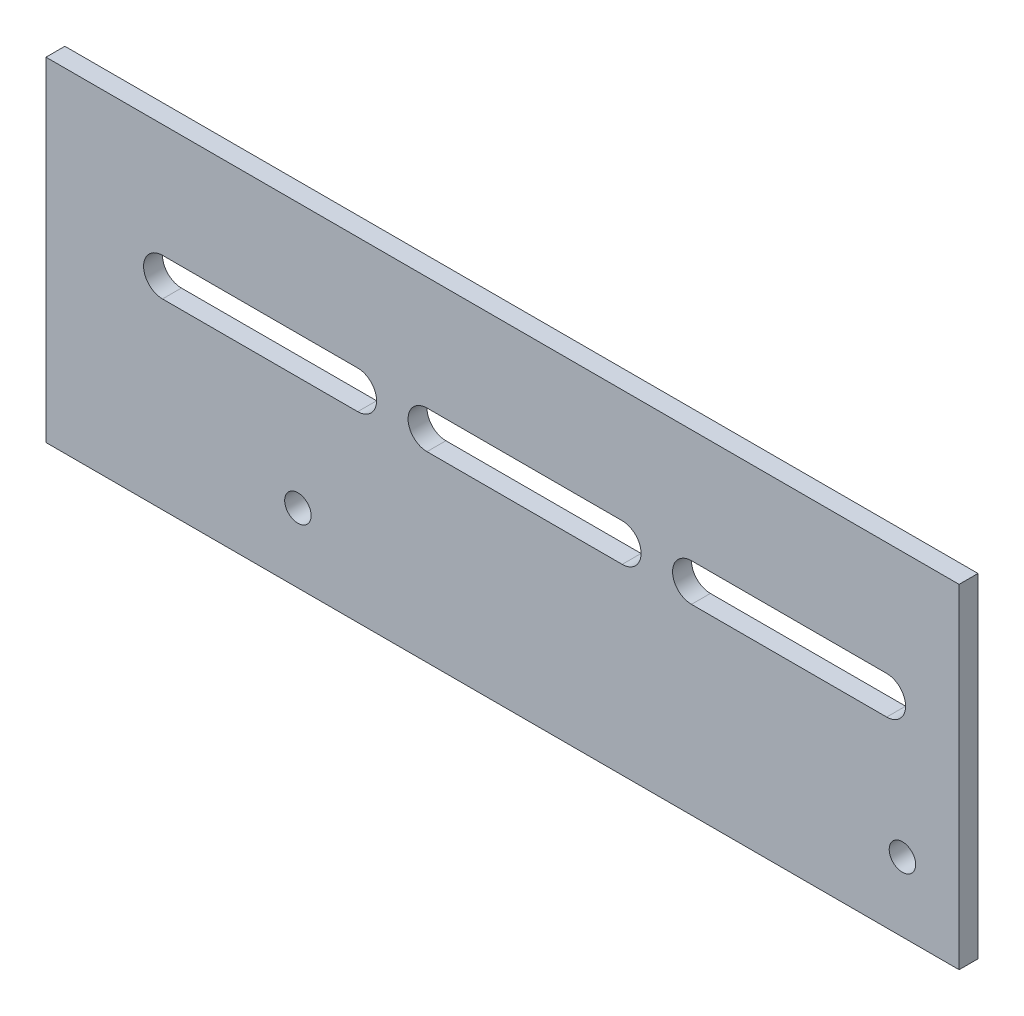
ISO-10303-21;
HEADER;
FILE_DESCRIPTION(('STEP AP214'),'2;1');
FILE_NAME('part.step','',(''),(''),'','','');
FILE_SCHEMA(('AUTOMOTIVE_DESIGN { 1 0 10303 214 1 1 1 1 }'));
ENDSEC;
DATA;
#1=APPLICATION_CONTEXT('core data for automotive mechanical design processes');
#2=APPLICATION_PROTOCOL_DEFINITION('international standard','automotive_design',2000,#1);
#3=PRODUCT_CONTEXT('',#1,'mechanical');
#4=PRODUCT('Part','Part','',(#3));
#5=PRODUCT_RELATED_PRODUCT_CATEGORY('part','',(#4));
#6=PRODUCT_DEFINITION_FORMATION('','',#4);
#7=PRODUCT_DEFINITION_CONTEXT('part definition',#1,'design');
#8=PRODUCT_DEFINITION('design','',#6,#7);
#9=PRODUCT_DEFINITION_SHAPE('','',#8);
#10=(LENGTH_UNIT() NAMED_UNIT(*) SI_UNIT(.MILLI.,.METRE.));
#11=(NAMED_UNIT(*) PLANE_ANGLE_UNIT() SI_UNIT($,.RADIAN.));
#12=(NAMED_UNIT(*) SI_UNIT($,.STERADIAN.) SOLID_ANGLE_UNIT());
#13=UNCERTAINTY_MEASURE_WITH_UNIT(LENGTH_MEASURE(1.E-05),#10,'distance_accuracy_value','');
#14=(GEOMETRIC_REPRESENTATION_CONTEXT(3) GLOBAL_UNCERTAINTY_ASSIGNED_CONTEXT((#13)) GLOBAL_UNIT_ASSIGNED_CONTEXT((#10,
#11,#12)) REPRESENTATION_CONTEXT('',''));
#15=CARTESIAN_POINT('',(0.,0.,0.));
#16=DIRECTION('',(0.,0.,1.));
#17=DIRECTION('',(1.,0.,0.));
#18=AXIS2_PLACEMENT_3D('',#15,#16,#17);
#19=CARTESIAN_POINT('',(0.,0.,3.));
#20=DIRECTION('',(0.,0.,1.));
#21=DIRECTION('',(1.,0.,0.));
#22=AXIS2_PLACEMENT_3D('',#19,#20,#21);
#23=PLANE('',#22);
#24=CARTESIAN_POINT('',(-51.,61.,3.));
#25=DIRECTION('',(0.,0.,1.));
#26=DIRECTION('',(1.,0.,0.));
#27=AXIS2_PLACEMENT_3D('',#24,#25,#26);
#28=CIRCLE('',#27,2.1);
#29=CARTESIAN_POINT('',(-48.9,61.,3.));
#30=VERTEX_POINT('',#29);
#31=EDGE_CURVE('E302',#30,#30,#28,.T.);
#32=ORIENTED_EDGE('',*,*,#31,.F.);
#33=EDGE_LOOP('',(#32));
#34=FACE_BOUND('',#33,.T.);
#35=DIRECTION('',(0.,-1.,0.));
#36=VECTOR('',#35,1.);
#37=CARTESIAN_POINT('',(-91.,103.,3.));
#38=LINE('',#37,#36);
#39=CARTESIAN_POINT('',(-91.,103.,3.));
#40=VERTEX_POINT('',#39);
#41=CARTESIAN_POINT('',(-91.,50.,3.));
#42=VERTEX_POINT('',#41);
#43=EDGE_CURVE('E309',#40,#42,#38,.T.);
#44=ORIENTED_EDGE('',*,*,#43,.T.);
#45=DIRECTION('',(1.,0.,0.));
#46=VECTOR('',#45,1.);
#47=CARTESIAN_POINT('',(-91.,50.,3.));
#48=LINE('',#47,#46);
#49=CARTESIAN_POINT('',(54.,50.,3.));
#50=VERTEX_POINT('',#49);
#51=EDGE_CURVE('E313',#42,#50,#48,.T.);
#52=ORIENTED_EDGE('',*,*,#51,.T.);
#53=DIRECTION('',(0.,1.,0.));
#54=VECTOR('',#53,1.);
#55=CARTESIAN_POINT('',(54.,50.,3.));
#56=LINE('',#55,#54);
#57=CARTESIAN_POINT('',(54.,103.,3.));
#58=VERTEX_POINT('',#57);
#59=EDGE_CURVE('E317',#50,#58,#56,.T.);
#60=ORIENTED_EDGE('',*,*,#59,.T.);
#61=DIRECTION('',(-1.,0.,0.));
#62=VECTOR('',#61,1.);
#63=CARTESIAN_POINT('',(54.,103.,3.));
#64=LINE('',#63,#62);
#65=EDGE_CURVE('E320',#58,#40,#64,.T.);
#66=ORIENTED_EDGE('',*,*,#65,.T.);
#67=EDGE_LOOP('',(#44,#52,#60,#66));
#68=FACE_BOUND('',#67,.T.);
#69=CARTESIAN_POINT('',(45.,61.,3.));
#70=DIRECTION('',(0.,0.,1.));
#71=DIRECTION('',(1.,0.,0.));
#72=AXIS2_PLACEMENT_3D('',#69,#70,#71);
#73=CIRCLE('',#72,2.1);
#74=CARTESIAN_POINT('',(47.1,61.,3.));
#75=VERTEX_POINT('',#74);
#76=EDGE_CURVE('E294',#75,#75,#73,.T.);
#77=ORIENTED_EDGE('',*,*,#76,.F.);
#78=EDGE_LOOP('',(#77));
#79=FACE_BOUND('',#78,.T.);
#80=DIRECTION('',(1.,0.,0.));
#81=VECTOR('',#80,1.);
#82=CARTESIAN_POINT('',(-72.5,79.,3.));
#83=LINE('',#82,#81);
#84=CARTESIAN_POINT('',(-72.5,79.,3.));
#85=VERTEX_POINT('',#84);
#86=CARTESIAN_POINT('',(-41.5,79.,3.));
#87=VERTEX_POINT('',#86);
#88=EDGE_CURVE('E254',#85,#87,#83,.T.);
#89=ORIENTED_EDGE('',*,*,#88,.F.);
#90=CARTESIAN_POINT('',(-72.5,82.,3.));
#91=DIRECTION('',(0.,0.,1.));
#92=DIRECTION('',(1.,0.,0.));
#93=AXIS2_PLACEMENT_3D('',#90,#91,#92);
#94=CIRCLE('',#93,3.);
#95=CARTESIAN_POINT('',(-72.5,85.,3.));
#96=VERTEX_POINT('',#95);
#97=EDGE_CURVE('E251',#96,#85,#94,.T.);
#98=ORIENTED_EDGE('',*,*,#97,.F.);
#99=DIRECTION('',(-1.,0.,0.));
#100=VECTOR('',#99,1.);
#101=CARTESIAN_POINT('',(-41.5,85.,3.));
#102=LINE('',#101,#100);
#103=CARTESIAN_POINT('',(-41.5,85.,3.));
#104=VERTEX_POINT('',#103);
#105=EDGE_CURVE('E262',#104,#96,#102,.T.);
#106=ORIENTED_EDGE('',*,*,#105,.F.);
#107=CARTESIAN_POINT('',(-41.5,82.,3.));
#108=DIRECTION('',(0.,0.,1.));
#109=DIRECTION('',(1.,0.,0.));
#110=AXIS2_PLACEMENT_3D('',#107,#108,#109);
#111=CIRCLE('',#110,3.);
#112=EDGE_CURVE('E258',#87,#104,#111,.T.);
#113=ORIENTED_EDGE('',*,*,#112,.F.);
#114=EDGE_LOOP('',(#89,#98,#106,#113));
#115=FACE_BOUND('',#114,.T.);
#116=DIRECTION('',(1.,0.,0.));
#117=VECTOR('',#116,1.);
#118=CARTESIAN_POINT('',(-30.5,79.,3.));
#119=LINE('',#118,#117);
#120=CARTESIAN_POINT('',(-30.5,79.,3.));
#121=VERTEX_POINT('',#120);
#122=CARTESIAN_POINT('',(0.5,79.,3.));
#123=VERTEX_POINT('',#122);
#124=EDGE_CURVE('E211',#121,#123,#119,.T.);
#125=ORIENTED_EDGE('',*,*,#124,.F.);
#126=CARTESIAN_POINT('',(-30.5,82.,3.));
#127=DIRECTION('',(0.,0.,1.));
#128=DIRECTION('',(1.,0.,0.));
#129=AXIS2_PLACEMENT_3D('',#126,#127,#128);
#130=CIRCLE('',#129,3.);
#131=CARTESIAN_POINT('',(-30.5,85.,3.));
#132=VERTEX_POINT('',#131);
#133=EDGE_CURVE('E208',#132,#121,#130,.T.);
#134=ORIENTED_EDGE('',*,*,#133,.F.);
#135=DIRECTION('',(-1.,0.,0.));
#136=VECTOR('',#135,1.);
#137=CARTESIAN_POINT('',(0.5,85.,3.));
#138=LINE('',#137,#136);
#139=CARTESIAN_POINT('',(0.5,85.,3.));
#140=VERTEX_POINT('',#139);
#141=EDGE_CURVE('E219',#140,#132,#138,.T.);
#142=ORIENTED_EDGE('',*,*,#141,.F.);
#143=CARTESIAN_POINT('',(0.499999999999997,82.,3.));
#144=DIRECTION('',(0.,0.,1.));
#145=DIRECTION('',(1.,0.,0.));
#146=AXIS2_PLACEMENT_3D('',#143,#144,#145);
#147=CIRCLE('',#146,3.);
#148=EDGE_CURVE('E215',#123,#140,#147,.T.);
#149=ORIENTED_EDGE('',*,*,#148,.F.);
#150=EDGE_LOOP('',(#125,#134,#142,#149));
#151=FACE_BOUND('',#150,.T.);
#152=DIRECTION('',(1.,0.,0.));
#153=VECTOR('',#152,1.);
#154=CARTESIAN_POINT('',(11.5,79.,3.));
#155=LINE('',#154,#153);
#156=CARTESIAN_POINT('',(11.5,79.,3.));
#157=VERTEX_POINT('',#156);
#158=CARTESIAN_POINT('',(42.5,79.,3.));
#159=VERTEX_POINT('',#158);
#160=EDGE_CURVE('E168',#157,#159,#155,.T.);
#161=ORIENTED_EDGE('',*,*,#160,.F.);
#162=CARTESIAN_POINT('',(11.5,82.,3.));
#163=DIRECTION('',(0.,0.,1.));
#164=DIRECTION('',(1.,0.,0.));
#165=AXIS2_PLACEMENT_3D('',#162,#163,#164);
#166=CIRCLE('',#165,3.);
#167=CARTESIAN_POINT('',(11.5,85.,3.));
#168=VERTEX_POINT('',#167);
#169=EDGE_CURVE('E159',#168,#157,#166,.T.);
#170=ORIENTED_EDGE('',*,*,#169,.F.);
#171=DIRECTION('',(-1.,0.,0.));
#172=VECTOR('',#171,1.);
#173=CARTESIAN_POINT('',(42.5,85.,3.));
#174=LINE('',#173,#172);
#175=CARTESIAN_POINT('',(42.5,85.,3.));
#176=VERTEX_POINT('',#175);
#177=EDGE_CURVE('E187',#176,#168,#174,.T.);
#178=ORIENTED_EDGE('',*,*,#177,.F.);
#179=CARTESIAN_POINT('',(42.5,82.,3.));
#180=DIRECTION('',(0.,0.,1.));
#181=DIRECTION('',(1.,0.,0.));
#182=AXIS2_PLACEMENT_3D('',#179,#180,#181);
#183=CIRCLE('',#182,3.);
#184=EDGE_CURVE('E181',#159,#176,#183,.T.);
#185=ORIENTED_EDGE('',*,*,#184,.F.);
#186=EDGE_LOOP('',(#161,#170,#178,#185));
#187=FACE_BOUND('',#186,.T.);
#188=ADVANCED_FACE('F45',(#34,#68,#79,#115,#151,#187),#23,.T.);
#189=CARTESIAN_POINT('',(0.,0.,0.));
#190=DIRECTION('',(0.,0.,1.));
#191=DIRECTION('',(1.,0.,0.));
#192=AXIS2_PLACEMENT_3D('',#189,#190,#191);
#193=PLANE('',#192);
#194=CARTESIAN_POINT('',(-30.5,82.,0.));
#195=DIRECTION('',(0.,0.,1.));
#196=DIRECTION('',(1.,0.,0.));
#197=AXIS2_PLACEMENT_3D('',#194,#195,#196);
#198=CIRCLE('',#197,3.);
#199=CARTESIAN_POINT('',(-30.5,85.,0.));
#200=VERTEX_POINT('',#199);
#201=CARTESIAN_POINT('',(-30.5,79.,0.));
#202=VERTEX_POINT('',#201);
#203=EDGE_CURVE('E177',#200,#202,#198,.T.);
#204=ORIENTED_EDGE('',*,*,#203,.T.);
#205=DIRECTION('',(1.,0.,0.));
#206=VECTOR('',#205,1.);
#207=CARTESIAN_POINT('',(-30.5,79.,0.));
#208=LINE('',#207,#206);
#209=CARTESIAN_POINT('',(0.5,79.,0.));
#210=VERTEX_POINT('',#209);
#211=EDGE_CURVE('E226',#202,#210,#208,.T.);
#212=ORIENTED_EDGE('',*,*,#211,.T.);
#213=CARTESIAN_POINT('',(0.499999999999997,82.,0.));
#214=DIRECTION('',(0.,0.,1.));
#215=DIRECTION('',(1.,0.,0.));
#216=AXIS2_PLACEMENT_3D('',#213,#214,#215);
#217=CIRCLE('',#216,3.);
#218=CARTESIAN_POINT('',(0.5,85.,0.));
#219=VERTEX_POINT('',#218);
#220=EDGE_CURVE('E230',#210,#219,#217,.T.);
#221=ORIENTED_EDGE('',*,*,#220,.T.);
#222=DIRECTION('',(-1.,0.,0.));
#223=VECTOR('',#222,1.);
#224=CARTESIAN_POINT('',(0.5,85.,0.));
#225=LINE('',#224,#223);
#226=EDGE_CURVE('E212',#219,#200,#225,.T.);
#227=ORIENTED_EDGE('',*,*,#226,.T.);
#228=EDGE_LOOP('',(#204,#212,#221,#227));
#229=FACE_BOUND('',#228,.T.);
#230=CARTESIAN_POINT('',(45.,61.,0.));
#231=DIRECTION('',(0.,0.,1.));
#232=DIRECTION('',(1.,0.,0.));
#233=AXIS2_PLACEMENT_3D('',#230,#231,#232);
#234=CIRCLE('',#233,2.1);
#235=CARTESIAN_POINT('',(47.1,61.,0.));
#236=VERTEX_POINT('',#235);
#237=EDGE_CURVE('E293',#236,#236,#234,.T.);
#238=ORIENTED_EDGE('',*,*,#237,.T.);
#239=EDGE_LOOP('',(#238));
#240=FACE_BOUND('',#239,.T.);
#241=CARTESIAN_POINT('',(-51.,61.,0.));
#242=DIRECTION('',(0.,0.,1.));
#243=DIRECTION('',(1.,0.,0.));
#244=AXIS2_PLACEMENT_3D('',#241,#242,#243);
#245=CIRCLE('',#244,2.1);
#246=CARTESIAN_POINT('',(-48.9,61.,0.));
#247=VERTEX_POINT('',#246);
#248=EDGE_CURVE('E298',#247,#247,#245,.T.);
#249=ORIENTED_EDGE('',*,*,#248,.T.);
#250=EDGE_LOOP('',(#249));
#251=FACE_BOUND('',#250,.T.);
#252=DIRECTION('',(0.,-1.,0.));
#253=VECTOR('',#252,1.);
#254=CARTESIAN_POINT('',(-91.,103.,0.));
#255=LINE('',#254,#253);
#256=CARTESIAN_POINT('',(-91.,103.,0.));
#257=VERTEX_POINT('',#256);
#258=CARTESIAN_POINT('',(-91.,50.,0.));
#259=VERTEX_POINT('',#258);
#260=EDGE_CURVE('E305',#257,#259,#255,.T.);
#261=ORIENTED_EDGE('',*,*,#260,.F.);
#262=DIRECTION('',(-1.,0.,0.));
#263=VECTOR('',#262,1.);
#264=CARTESIAN_POINT('',(54.,103.,0.));
#265=LINE('',#264,#263);
#266=CARTESIAN_POINT('',(54.,103.,0.));
#267=VERTEX_POINT('',#266);
#268=EDGE_CURVE('E314',#267,#257,#265,.T.);
#269=ORIENTED_EDGE('',*,*,#268,.F.);
#270=DIRECTION('',(0.,1.,0.));
#271=VECTOR('',#270,1.);
#272=CARTESIAN_POINT('',(54.,50.,0.));
#273=LINE('',#272,#271);
#274=CARTESIAN_POINT('',(54.,50.,0.));
#275=VERTEX_POINT('',#274);
#276=EDGE_CURVE('E330',#275,#267,#273,.T.);
#277=ORIENTED_EDGE('',*,*,#276,.F.);
#278=DIRECTION('',(1.,0.,0.));
#279=VECTOR('',#278,1.);
#280=CARTESIAN_POINT('',(-91.,50.,0.));
#281=LINE('',#280,#279);
#282=EDGE_CURVE('E327',#259,#275,#281,.T.);
#283=ORIENTED_EDGE('',*,*,#282,.F.);
#284=EDGE_LOOP('',(#261,#269,#277,#283));
#285=FACE_BOUND('',#284,.T.);
#286=CARTESIAN_POINT('',(-72.5,82.,0.));
#287=DIRECTION('',(0.,0.,1.));
#288=DIRECTION('',(1.,0.,0.));
#289=AXIS2_PLACEMENT_3D('',#286,#287,#288);
#290=CIRCLE('',#289,3.);
#291=CARTESIAN_POINT('',(-72.5,85.,0.));
#292=VERTEX_POINT('',#291);
#293=CARTESIAN_POINT('',(-72.5,79.,0.));
#294=VERTEX_POINT('',#293);
#295=EDGE_CURVE('E250',#292,#294,#290,.T.);
#296=ORIENTED_EDGE('',*,*,#295,.T.);
#297=DIRECTION('',(1.,0.,0.));
#298=VECTOR('',#297,1.);
#299=CARTESIAN_POINT('',(-72.5,79.,0.));
#300=LINE('',#299,#298);
#301=CARTESIAN_POINT('',(-41.5,79.,0.));
#302=VERTEX_POINT('',#301);
#303=EDGE_CURVE('E269',#294,#302,#300,.T.);
#304=ORIENTED_EDGE('',*,*,#303,.T.);
#305=CARTESIAN_POINT('',(-41.5,82.,0.));
#306=DIRECTION('',(0.,0.,1.));
#307=DIRECTION('',(1.,0.,0.));
#308=AXIS2_PLACEMENT_3D('',#305,#306,#307);
#309=CIRCLE('',#308,3.);
#310=CARTESIAN_POINT('',(-41.5,85.,0.));
#311=VERTEX_POINT('',#310);
#312=EDGE_CURVE('E273',#302,#311,#309,.T.);
#313=ORIENTED_EDGE('',*,*,#312,.T.);
#314=DIRECTION('',(-1.,0.,0.));
#315=VECTOR('',#314,1.);
#316=CARTESIAN_POINT('',(-41.5,85.,0.));
#317=LINE('',#316,#315);
#318=EDGE_CURVE('E255',#311,#292,#317,.T.);
#319=ORIENTED_EDGE('',*,*,#318,.T.);
#320=EDGE_LOOP('',(#296,#304,#313,#319));
#321=FACE_BOUND('',#320,.T.);
#322=CARTESIAN_POINT('',(11.5,82.,0.));
#323=DIRECTION('',(0.,0.,1.));
#324=DIRECTION('',(1.,0.,0.));
#325=AXIS2_PLACEMENT_3D('',#322,#323,#324);
#326=CIRCLE('',#325,3.);
#327=CARTESIAN_POINT('',(11.5,85.,0.));
#328=VERTEX_POINT('',#327);
#329=CARTESIAN_POINT('',(11.5,79.,0.));
#330=VERTEX_POINT('',#329);
#331=EDGE_CURVE('E69',#328,#330,#326,.T.);
#332=ORIENTED_EDGE('',*,*,#331,.T.);
#333=DIRECTION('',(1.,0.,0.));
#334=VECTOR('',#333,1.);
#335=CARTESIAN_POINT('',(11.5,79.,0.));
#336=LINE('',#335,#334);
#337=CARTESIAN_POINT('',(42.5,79.,0.));
#338=VERTEX_POINT('',#337);
#339=EDGE_CURVE('E175',#330,#338,#336,.T.);
#340=ORIENTED_EDGE('',*,*,#339,.T.);
#341=CARTESIAN_POINT('',(42.5,82.,0.));
#342=DIRECTION('',(0.,0.,1.));
#343=DIRECTION('',(1.,0.,0.));
#344=AXIS2_PLACEMENT_3D('',#341,#342,#343);
#345=CIRCLE('',#344,3.);
#346=CARTESIAN_POINT('',(42.5,85.,0.));
#347=VERTEX_POINT('',#346);
#348=EDGE_CURVE('E195',#338,#347,#345,.T.);
#349=ORIENTED_EDGE('',*,*,#348,.T.);
#350=DIRECTION('',(-1.,0.,0.));
#351=VECTOR('',#350,1.);
#352=CARTESIAN_POINT('',(42.5,85.,0.));
#353=LINE('',#352,#351);
#354=EDGE_CURVE('E169',#347,#328,#353,.T.);
#355=ORIENTED_EDGE('',*,*,#354,.T.);
#356=EDGE_LOOP('',(#332,#340,#349,#355));
#357=FACE_BOUND('',#356,.T.);
#358=ADVANCED_FACE('F353',(#229,#240,#251,#285,#321,#357),#193,.F.);
#359=CARTESIAN_POINT('',(-91.,103.,3.));
#360=DIRECTION('',(1.,0.,0.));
#361=DIRECTION('',(0.,0.,-1.));
#362=AXIS2_PLACEMENT_3D('',#359,#360,#361);
#363=PLANE('',#362);
#364=ORIENTED_EDGE('',*,*,#260,.T.);
#365=DIRECTION('',(0.,0.,-1.));
#366=VECTOR('',#365,1.);
#367=CARTESIAN_POINT('',(-91.,50.,3.));
#368=LINE('',#367,#366);
#369=EDGE_CURVE('E11',#42,#259,#368,.T.);
#370=ORIENTED_EDGE('',*,*,#369,.F.);
#371=ORIENTED_EDGE('',*,*,#43,.F.);
#372=DIRECTION('',(0.,0.,-1.));
#373=VECTOR('',#372,1.);
#374=CARTESIAN_POINT('',(-91.,103.,3.));
#375=LINE('',#374,#373);
#376=EDGE_CURVE('E323',#40,#257,#375,.T.);
#377=ORIENTED_EDGE('',*,*,#376,.T.);
#378=EDGE_LOOP('',(#364,#370,#371,#377));
#379=FACE_BOUND('',#378,.T.);
#380=ADVANCED_FACE('F47',(#379),#363,.F.);
#381=CARTESIAN_POINT('',(-91.,50.,3.));
#382=DIRECTION('',(0.,1.,0.));
#383=DIRECTION('',(0.,0.,1.));
#384=AXIS2_PLACEMENT_3D('',#381,#382,#383);
#385=PLANE('',#384);
#386=ORIENTED_EDGE('',*,*,#282,.T.);
#387=DIRECTION('',(0.,0.,-1.));
#388=VECTOR('',#387,1.);
#389=CARTESIAN_POINT('',(54.,50.,3.));
#390=LINE('',#389,#388);
#391=EDGE_CURVE('E54',#50,#275,#390,.T.);
#392=ORIENTED_EDGE('',*,*,#391,.F.);
#393=ORIENTED_EDGE('',*,*,#51,.F.);
#394=ORIENTED_EDGE('',*,*,#369,.T.);
#395=EDGE_LOOP('',(#386,#392,#393,#394));
#396=FACE_BOUND('',#395,.T.);
#397=ADVANCED_FACE('F364',(#396),#385,.F.);
#398=CARTESIAN_POINT('',(54.,50.,3.));
#399=DIRECTION('',(-1.,0.,0.));
#400=DIRECTION('',(0.,0.,1.));
#401=AXIS2_PLACEMENT_3D('',#398,#399,#400);
#402=PLANE('',#401);
#403=ORIENTED_EDGE('',*,*,#276,.T.);
#404=DIRECTION('',(0.,0.,-1.));
#405=VECTOR('',#404,1.);
#406=CARTESIAN_POINT('',(54.,103.,3.));
#407=LINE('',#406,#405);
#408=EDGE_CURVE('E338',#58,#267,#407,.T.);
#409=ORIENTED_EDGE('',*,*,#408,.F.);
#410=ORIENTED_EDGE('',*,*,#59,.F.);
#411=ORIENTED_EDGE('',*,*,#391,.T.);
#412=EDGE_LOOP('',(#403,#409,#410,#411));
#413=FACE_BOUND('',#412,.T.);
#414=ADVANCED_FACE('F347',(#413),#402,.F.);
#415=CARTESIAN_POINT('',(54.,103.,3.));
#416=DIRECTION('',(0.,-1.,0.));
#417=DIRECTION('',(0.,0.,-1.));
#418=AXIS2_PLACEMENT_3D('',#415,#416,#417);
#419=PLANE('',#418);
#420=ORIENTED_EDGE('',*,*,#268,.T.);
#421=ORIENTED_EDGE('',*,*,#376,.F.);
#422=ORIENTED_EDGE('',*,*,#65,.F.);
#423=ORIENTED_EDGE('',*,*,#408,.T.);
#424=EDGE_LOOP('',(#420,#421,#422,#423));
#425=FACE_BOUND('',#424,.T.);
#426=ADVANCED_FACE('F357',(#425),#419,.F.);
#427=CARTESIAN_POINT('',(-51.,61.,3.));
#428=DIRECTION('',(0.,0.,-1.));
#429=DIRECTION('',(-1.,0.,0.));
#430=AXIS2_PLACEMENT_3D('',#427,#428,#429);
#431=CYLINDRICAL_SURFACE('',#430,2.1);
#432=ORIENTED_EDGE('',*,*,#31,.T.);
#433=EDGE_LOOP('',(#432));
#434=FACE_BOUND('',#433,.T.);
#435=ORIENTED_EDGE('',*,*,#248,.F.);
#436=EDGE_LOOP('',(#435));
#437=FACE_BOUND('',#436,.T.);
#438=ADVANCED_FACE('F379',(#434,#437),#431,.F.);
#439=CARTESIAN_POINT('',(45.,61.,3.));
#440=DIRECTION('',(0.,0.,-1.));
#441=DIRECTION('',(-1.,0.,0.));
#442=AXIS2_PLACEMENT_3D('',#439,#440,#441);
#443=CYLINDRICAL_SURFACE('',#442,2.1);
#444=ORIENTED_EDGE('',*,*,#76,.T.);
#445=EDGE_LOOP('',(#444));
#446=FACE_BOUND('',#445,.T.);
#447=ORIENTED_EDGE('',*,*,#237,.F.);
#448=EDGE_LOOP('',(#447));
#449=FACE_BOUND('',#448,.T.);
#450=ADVANCED_FACE('F385',(#446,#449),#443,.F.);
#451=CARTESIAN_POINT('',(-72.5,82.,3.));
#452=DIRECTION('',(0.,0.,-1.));
#453=DIRECTION('',(-1.,0.,0.));
#454=AXIS2_PLACEMENT_3D('',#451,#452,#453);
#455=CYLINDRICAL_SURFACE('',#454,3.);
#456=ORIENTED_EDGE('',*,*,#295,.F.);
#457=DIRECTION('',(0.,0.,-1.));
#458=VECTOR('',#457,1.);
#459=CARTESIAN_POINT('',(-72.5,85.,3.));
#460=LINE('',#459,#458);
#461=EDGE_CURVE('E265',#96,#292,#460,.T.);
#462=ORIENTED_EDGE('',*,*,#461,.F.);
#463=ORIENTED_EDGE('',*,*,#97,.T.);
#464=DIRECTION('',(0.,0.,-1.));
#465=VECTOR('',#464,1.);
#466=CARTESIAN_POINT('',(-72.5,79.,3.));
#467=LINE('',#466,#465);
#468=EDGE_CURVE('E289',#85,#294,#467,.T.);
#469=ORIENTED_EDGE('',*,*,#468,.T.);
#470=EDGE_LOOP('',(#456,#462,#463,#469));
#471=FACE_BOUND('',#470,.T.);
#472=ADVANCED_FACE('F389',(#471),#455,.F.);
#473=CARTESIAN_POINT('',(-72.5,79.,3.));
#474=DIRECTION('',(0.,1.,0.));
#475=DIRECTION('',(0.,0.,1.));
#476=AXIS2_PLACEMENT_3D('',#473,#474,#475);
#477=PLANE('',#476);
#478=ORIENTED_EDGE('',*,*,#303,.F.);
#479=ORIENTED_EDGE('',*,*,#468,.F.);
#480=ORIENTED_EDGE('',*,*,#88,.T.);
#481=DIRECTION('',(0.,0.,-1.));
#482=VECTOR('',#481,1.);
#483=CARTESIAN_POINT('',(-41.5,79.,3.));
#484=LINE('',#483,#482);
#485=EDGE_CURVE('E286',#87,#302,#484,.T.);
#486=ORIENTED_EDGE('',*,*,#485,.T.);
#487=EDGE_LOOP('',(#478,#479,#480,#486));
#488=FACE_BOUND('',#487,.T.);
#489=ADVANCED_FACE('F396',(#488),#477,.T.);
#490=CARTESIAN_POINT('',(-41.5,82.,3.));
#491=DIRECTION('',(0.,0.,-1.));
#492=DIRECTION('',(-1.,0.,0.));
#493=AXIS2_PLACEMENT_3D('',#490,#491,#492);
#494=CYLINDRICAL_SURFACE('',#493,3.);
#495=ORIENTED_EDGE('',*,*,#312,.F.);
#496=ORIENTED_EDGE('',*,*,#485,.F.);
#497=ORIENTED_EDGE('',*,*,#112,.T.);
#498=DIRECTION('',(0.,0.,-1.));
#499=VECTOR('',#498,1.);
#500=CARTESIAN_POINT('',(-41.5,85.,3.));
#501=LINE('',#500,#499);
#502=EDGE_CURVE('E283',#104,#311,#501,.T.);
#503=ORIENTED_EDGE('',*,*,#502,.T.);
#504=EDGE_LOOP('',(#495,#496,#497,#503));
#505=FACE_BOUND('',#504,.T.);
#506=ADVANCED_FACE('F403',(#505),#494,.F.);
#507=CARTESIAN_POINT('',(-41.5,85.,3.));
#508=DIRECTION('',(0.,-1.,0.));
#509=DIRECTION('',(0.,0.,-1.));
#510=AXIS2_PLACEMENT_3D('',#507,#508,#509);
#511=PLANE('',#510);
#512=ORIENTED_EDGE('',*,*,#318,.F.);
#513=ORIENTED_EDGE('',*,*,#502,.F.);
#514=ORIENTED_EDGE('',*,*,#105,.T.);
#515=ORIENTED_EDGE('',*,*,#461,.T.);
#516=EDGE_LOOP('',(#512,#513,#514,#515));
#517=FACE_BOUND('',#516,.T.);
#518=ADVANCED_FACE('F407',(#517),#511,.T.);
#519=CARTESIAN_POINT('',(-30.5,82.,3.));
#520=DIRECTION('',(0.,0.,-1.));
#521=DIRECTION('',(-1.,0.,0.));
#522=AXIS2_PLACEMENT_3D('',#519,#520,#521);
#523=CYLINDRICAL_SURFACE('',#522,3.);
#524=ORIENTED_EDGE('',*,*,#203,.F.);
#525=DIRECTION('',(0.,0.,-1.));
#526=VECTOR('',#525,1.);
#527=CARTESIAN_POINT('',(-30.5,85.,3.));
#528=LINE('',#527,#526);
#529=EDGE_CURVE('E222',#132,#200,#528,.T.);
#530=ORIENTED_EDGE('',*,*,#529,.F.);
#531=ORIENTED_EDGE('',*,*,#133,.T.);
#532=DIRECTION('',(0.,0.,-1.));
#533=VECTOR('',#532,1.);
#534=CARTESIAN_POINT('',(-30.5,79.,3.));
#535=LINE('',#534,#533);
#536=EDGE_CURVE('E246',#121,#202,#535,.T.);
#537=ORIENTED_EDGE('',*,*,#536,.T.);
#538=EDGE_LOOP('',(#524,#530,#531,#537));
#539=FACE_BOUND('',#538,.T.);
#540=ADVANCED_FACE('F411',(#539),#523,.F.);
#541=CARTESIAN_POINT('',(-30.5,79.,3.));
#542=DIRECTION('',(0.,1.,0.));
#543=DIRECTION('',(0.,0.,1.));
#544=AXIS2_PLACEMENT_3D('',#541,#542,#543);
#545=PLANE('',#544);
#546=ORIENTED_EDGE('',*,*,#211,.F.);
#547=ORIENTED_EDGE('',*,*,#536,.F.);
#548=ORIENTED_EDGE('',*,*,#124,.T.);
#549=DIRECTION('',(0.,0.,-1.));
#550=VECTOR('',#549,1.);
#551=CARTESIAN_POINT('',(0.5,79.,3.));
#552=LINE('',#551,#550);
#553=EDGE_CURVE('E243',#123,#210,#552,.T.);
#554=ORIENTED_EDGE('',*,*,#553,.T.);
#555=EDGE_LOOP('',(#546,#547,#548,#554));
#556=FACE_BOUND('',#555,.T.);
#557=ADVANCED_FACE('F415',(#556),#545,.T.);
#558=CARTESIAN_POINT('',(0.499999999999997,82.,3.));
#559=DIRECTION('',(0.,0.,-1.));
#560=DIRECTION('',(-1.,0.,0.));
#561=AXIS2_PLACEMENT_3D('',#558,#559,#560);
#562=CYLINDRICAL_SURFACE('',#561,3.);
#563=ORIENTED_EDGE('',*,*,#220,.F.);
#564=ORIENTED_EDGE('',*,*,#553,.F.);
#565=ORIENTED_EDGE('',*,*,#148,.T.);
#566=DIRECTION('',(0.,0.,-1.));
#567=VECTOR('',#566,1.);
#568=CARTESIAN_POINT('',(0.5,85.,3.));
#569=LINE('',#568,#567);
#570=EDGE_CURVE('E240',#140,#219,#569,.T.);
#571=ORIENTED_EDGE('',*,*,#570,.T.);
#572=EDGE_LOOP('',(#563,#564,#565,#571));
#573=FACE_BOUND('',#572,.T.);
#574=ADVANCED_FACE('F419',(#573),#562,.F.);
#575=CARTESIAN_POINT('',(0.5,85.,3.));
#576=DIRECTION('',(0.,-1.,0.));
#577=DIRECTION('',(0.,0.,-1.));
#578=AXIS2_PLACEMENT_3D('',#575,#576,#577);
#579=PLANE('',#578);
#580=ORIENTED_EDGE('',*,*,#226,.F.);
#581=ORIENTED_EDGE('',*,*,#570,.F.);
#582=ORIENTED_EDGE('',*,*,#141,.T.);
#583=ORIENTED_EDGE('',*,*,#529,.T.);
#584=EDGE_LOOP('',(#580,#581,#582,#583));
#585=FACE_BOUND('',#584,.T.);
#586=ADVANCED_FACE('F423',(#585),#579,.T.);
#587=CARTESIAN_POINT('',(11.5,82.,3.));
#588=DIRECTION('',(0.,0.,-1.));
#589=DIRECTION('',(-1.,0.,0.));
#590=AXIS2_PLACEMENT_3D('',#587,#588,#589);
#591=CYLINDRICAL_SURFACE('',#590,3.);
#592=ORIENTED_EDGE('',*,*,#331,.F.);
#593=DIRECTION('',(0.,0.,-1.));
#594=VECTOR('',#593,1.);
#595=CARTESIAN_POINT('',(11.5,85.,3.));
#596=LINE('',#595,#594);
#597=EDGE_CURVE('E163',#168,#328,#596,.T.);
#598=ORIENTED_EDGE('',*,*,#597,.F.);
#599=ORIENTED_EDGE('',*,*,#169,.T.);
#600=DIRECTION('',(0.,0.,-1.));
#601=VECTOR('',#600,1.);
#602=CARTESIAN_POINT('',(11.5,79.,3.));
#603=LINE('',#602,#601);
#604=EDGE_CURVE('E162',#157,#330,#603,.T.);
#605=ORIENTED_EDGE('',*,*,#604,.T.);
#606=EDGE_LOOP('',(#592,#598,#599,#605));
#607=FACE_BOUND('',#606,.T.);
#608=ADVANCED_FACE('F161',(#607),#591,.F.);
#609=CARTESIAN_POINT('',(11.5,79.,3.));
#610=DIRECTION('',(0.,1.,0.));
#611=DIRECTION('',(0.,0.,1.));
#612=AXIS2_PLACEMENT_3D('',#609,#610,#611);
#613=PLANE('',#612);
#614=ORIENTED_EDGE('',*,*,#339,.F.);
#615=ORIENTED_EDGE('',*,*,#604,.F.);
#616=ORIENTED_EDGE('',*,*,#160,.T.);
#617=DIRECTION('',(0.,0.,-1.));
#618=VECTOR('',#617,1.);
#619=CARTESIAN_POINT('',(42.5,79.,3.));
#620=LINE('',#619,#618);
#621=EDGE_CURVE('E178',#159,#338,#620,.T.);
#622=ORIENTED_EDGE('',*,*,#621,.T.);
#623=EDGE_LOOP('',(#614,#615,#616,#622));
#624=FACE_BOUND('',#623,.T.);
#625=ADVANCED_FACE('F172',(#624),#613,.T.);
#626=CARTESIAN_POINT('',(42.5,82.,3.));
#627=DIRECTION('',(0.,0.,-1.));
#628=DIRECTION('',(-1.,0.,0.));
#629=AXIS2_PLACEMENT_3D('',#626,#627,#628);
#630=CYLINDRICAL_SURFACE('',#629,3.);
#631=ORIENTED_EDGE('',*,*,#348,.F.);
#632=ORIENTED_EDGE('',*,*,#621,.F.);
#633=ORIENTED_EDGE('',*,*,#184,.T.);
#634=DIRECTION('',(0.,0.,-1.));
#635=VECTOR('',#634,1.);
#636=CARTESIAN_POINT('',(42.5,85.,3.));
#637=LINE('',#636,#635);
#638=EDGE_CURVE('E61',#176,#347,#637,.T.);
#639=ORIENTED_EDGE('',*,*,#638,.T.);
#640=EDGE_LOOP('',(#631,#632,#633,#639));
#641=FACE_BOUND('',#640,.T.);
#642=ADVANCED_FACE('F432',(#641),#630,.F.);
#643=CARTESIAN_POINT('',(42.5,85.,3.));
#644=DIRECTION('',(0.,-1.,0.));
#645=DIRECTION('',(0.,0.,-1.));
#646=AXIS2_PLACEMENT_3D('',#643,#644,#645);
#647=PLANE('',#646);
#648=ORIENTED_EDGE('',*,*,#354,.F.);
#649=ORIENTED_EDGE('',*,*,#638,.F.);
#650=ORIENTED_EDGE('',*,*,#177,.T.);
#651=ORIENTED_EDGE('',*,*,#597,.T.);
#652=EDGE_LOOP('',(#648,#649,#650,#651));
#653=FACE_BOUND('',#652,.T.);
#654=ADVANCED_FACE('F435',(#653),#647,.T.);
#655=CLOSED_SHELL('',(#188,#358,#380,#397,#414,#426,#438,#450,#472,#489,#506,#518,#540,#557,
#574,#586,#608,#625,#642,#654));
#656=MANIFOLD_SOLID_BREP('B2',#655);
#657=ADVANCED_BREP_SHAPE_REPRESENTATION('',(#18,#656),#14);
#658=SHAPE_DEFINITION_REPRESENTATION(#9,#657);
ENDSEC;
END-ISO-10303-21;
